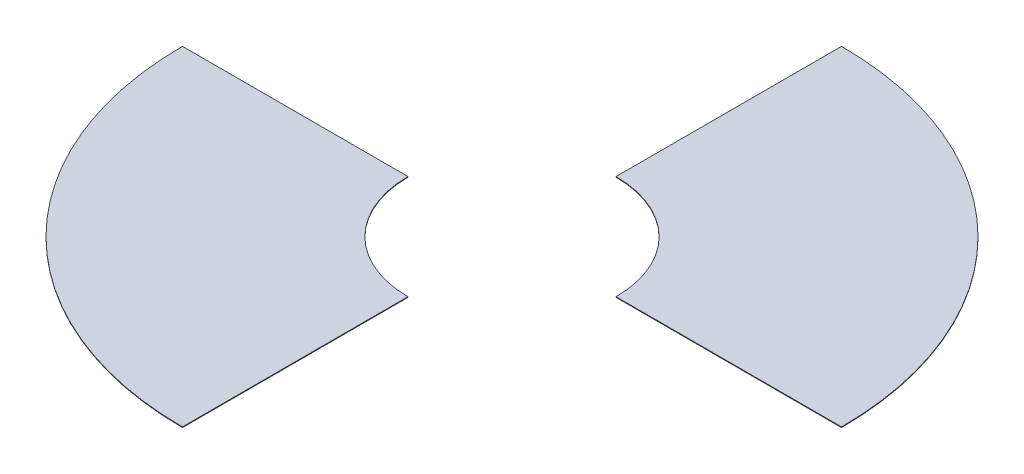
ISO-10303-21;
HEADER;
FILE_DESCRIPTION(('STEP AP214'),'2;1');
FILE_NAME('part.step','',(''),(''),'','','');
FILE_SCHEMA(('AUTOMOTIVE_DESIGN { 1 0 10303 214 1 1 1 1 }'));
ENDSEC;
DATA;
#1=APPLICATION_CONTEXT('core data for automotive mechanical design processes');
#2=APPLICATION_PROTOCOL_DEFINITION('international standard','automotive_design',2000,#1);
#3=PRODUCT_CONTEXT('',#1,'mechanical');
#4=PRODUCT('Part','Part','',(#3));
#5=PRODUCT_RELATED_PRODUCT_CATEGORY('part','',(#4));
#6=PRODUCT_DEFINITION_FORMATION('','',#4);
#7=PRODUCT_DEFINITION_CONTEXT('part definition',#1,'design');
#8=PRODUCT_DEFINITION('design','',#6,#7);
#9=PRODUCT_DEFINITION_SHAPE('','',#8);
#10=(LENGTH_UNIT() NAMED_UNIT(*) SI_UNIT(.MILLI.,.METRE.));
#11=(NAMED_UNIT(*) PLANE_ANGLE_UNIT() SI_UNIT($,.RADIAN.));
#12=(NAMED_UNIT(*) SI_UNIT($,.STERADIAN.) SOLID_ANGLE_UNIT());
#13=UNCERTAINTY_MEASURE_WITH_UNIT(LENGTH_MEASURE(1.E-05),#10,'distance_accuracy_value','');
#14=(GEOMETRIC_REPRESENTATION_CONTEXT(3) GLOBAL_UNCERTAINTY_ASSIGNED_CONTEXT((#13)) GLOBAL_UNIT_ASSIGNED_CONTEXT((#10,
#11,#12)) REPRESENTATION_CONTEXT('',''));
#15=CARTESIAN_POINT('',(0.,0.,0.));
#16=DIRECTION('',(0.,0.,1.));
#17=DIRECTION('',(1.,0.,0.));
#18=AXIS2_PLACEMENT_3D('',#15,#16,#17);
#19=CARTESIAN_POINT('',(0.,0.508,0.));
#20=DIRECTION('',(0.,-1.,0.));
#21=DIRECTION('',(0.,0.,-1.));
#22=AXIS2_PLACEMENT_3D('',#19,#20,#21);
#23=CYLINDRICAL_SURFACE('',#22,76.2);
#24=CARTESIAN_POINT('',(0.,0.,0.));
#25=DIRECTION('',(0.,-1.,0.));
#26=DIRECTION('',(0.,0.,1.));
#27=AXIS2_PLACEMENT_3D('',#24,#25,#26);
#28=CIRCLE('',#27,76.2);
#29=CARTESIAN_POINT('',(0.,0.,76.2));
#30=VERTEX_POINT('',#29);
#31=CARTESIAN_POINT('',(-76.2,0.,0.));
#32=VERTEX_POINT('',#31);
#33=EDGE_CURVE('E106',#30,#32,#28,.T.);
#34=ORIENTED_EDGE('',*,*,#33,.T.);
#35=DIRECTION('',(0.,-1.,0.));
#36=VECTOR('',#35,1.);
#37=CARTESIAN_POINT('',(-76.2,0.508,0.));
#38=LINE('',#37,#36);
#39=CARTESIAN_POINT('',(-76.2,0.508,0.));
#40=VERTEX_POINT('',#39);
#41=EDGE_CURVE('E12',#40,#32,#38,.T.);
#42=ORIENTED_EDGE('',*,*,#41,.F.);
#43=CARTESIAN_POINT('',(0.,0.508,0.));
#44=DIRECTION('',(0.,-1.,0.));
#45=DIRECTION('',(0.,0.,1.));
#46=AXIS2_PLACEMENT_3D('',#43,#44,#45);
#47=CIRCLE('',#46,76.2);
#48=CARTESIAN_POINT('',(0.,0.508,76.2));
#49=VERTEX_POINT('',#48);
#50=EDGE_CURVE('E94',#49,#40,#47,.T.);
#51=ORIENTED_EDGE('',*,*,#50,.F.);
#52=DIRECTION('',(0.,-1.,0.));
#53=VECTOR('',#52,1.);
#54=CARTESIAN_POINT('',(0.,0.508,76.2));
#55=LINE('',#54,#53);
#56=EDGE_CURVE('E102',#49,#30,#55,.T.);
#57=ORIENTED_EDGE('',*,*,#56,.T.);
#58=EDGE_LOOP('',(#34,#42,#51,#57));
#59=FACE_BOUND('',#58,.T.);
#60=ADVANCED_FACE('F43',(#59),#23,.F.);
#61=CARTESIAN_POINT('',(-76.2,0.508,0.));
#62=DIRECTION('',(0.,0.,1.));
#63=DIRECTION('',(1.,0.,0.));
#64=AXIS2_PLACEMENT_3D('',#61,#62,#63);
#65=PLANE('',#64);
#66=DIRECTION('',(-1.,0.,0.));
#67=VECTOR('',#66,1.);
#68=CARTESIAN_POINT('',(-76.2,0.,0.));
#69=LINE('',#68,#67);
#70=CARTESIAN_POINT('',(-241.3,0.,0.));
#71=VERTEX_POINT('',#70);
#72=EDGE_CURVE('E98',#32,#71,#69,.T.);
#73=ORIENTED_EDGE('',*,*,#72,.T.);
#74=DIRECTION('',(0.,-1.,0.));
#75=VECTOR('',#74,1.);
#76=CARTESIAN_POINT('',(-241.3,0.508,0.));
#77=LINE('',#76,#75);
#78=CARTESIAN_POINT('',(-241.3,0.508,0.));
#79=VERTEX_POINT('',#78);
#80=EDGE_CURVE('E51',#79,#71,#77,.T.);
#81=ORIENTED_EDGE('',*,*,#80,.F.);
#82=DIRECTION('',(-1.,0.,0.));
#83=VECTOR('',#82,1.);
#84=CARTESIAN_POINT('',(-76.2,0.508,0.));
#85=LINE('',#84,#83);
#86=EDGE_CURVE('E89',#40,#79,#85,.T.);
#87=ORIENTED_EDGE('',*,*,#86,.F.);
#88=ORIENTED_EDGE('',*,*,#41,.T.);
#89=EDGE_LOOP('',(#73,#81,#87,#88));
#90=FACE_BOUND('',#89,.T.);
#91=ADVANCED_FACE('F97',(#90),#65,.F.);
#92=CARTESIAN_POINT('',(0.,0.508,0.));
#93=DIRECTION('',(0.,-1.,0.));
#94=DIRECTION('',(0.,0.,-1.));
#95=AXIS2_PLACEMENT_3D('',#92,#93,#94);
#96=CYLINDRICAL_SURFACE('',#95,241.3);
#97=CARTESIAN_POINT('',(0.,0.,0.));
#98=DIRECTION('',(0.,1.,0.));
#99=DIRECTION('',(0.,0.,1.));
#100=AXIS2_PLACEMENT_3D('',#97,#98,#99);
#101=CIRCLE('',#100,241.3);
#102=CARTESIAN_POINT('',(0.,0.,241.3));
#103=VERTEX_POINT('',#102);
#104=EDGE_CURVE('E76',#71,#103,#101,.T.);
#105=ORIENTED_EDGE('',*,*,#104,.T.);
#106=DIRECTION('',(0.,-1.,0.));
#107=VECTOR('',#106,1.);
#108=CARTESIAN_POINT('',(0.,0.508,241.3));
#109=LINE('',#108,#107);
#110=CARTESIAN_POINT('',(0.,0.508,241.3));
#111=VERTEX_POINT('',#110);
#112=EDGE_CURVE('E99',#111,#103,#109,.T.);
#113=ORIENTED_EDGE('',*,*,#112,.F.);
#114=CARTESIAN_POINT('',(0.,0.508,0.));
#115=DIRECTION('',(0.,1.,0.));
#116=DIRECTION('',(0.,0.,1.));
#117=AXIS2_PLACEMENT_3D('',#114,#115,#116);
#118=CIRCLE('',#117,241.3);
#119=EDGE_CURVE('E92',#79,#111,#118,.T.);
#120=ORIENTED_EDGE('',*,*,#119,.F.);
#121=ORIENTED_EDGE('',*,*,#80,.T.);
#122=EDGE_LOOP('',(#105,#113,#120,#121));
#123=FACE_BOUND('',#122,.T.);
#124=ADVANCED_FACE('F100',(#123),#96,.T.);
#125=CARTESIAN_POINT('',(0.,0.508,76.2));
#126=DIRECTION('',(-1.,0.,0.));
#127=DIRECTION('',(0.,0.,1.));
#128=AXIS2_PLACEMENT_3D('',#125,#126,#127);
#129=PLANE('',#128);
#130=DIRECTION('',(0.,0.,-1.));
#131=VECTOR('',#130,1.);
#132=CARTESIAN_POINT('',(0.,0.,76.2));
#133=LINE('',#132,#131);
#134=EDGE_CURVE('E82',#103,#30,#133,.T.);
#135=ORIENTED_EDGE('',*,*,#134,.T.);
#136=ORIENTED_EDGE('',*,*,#56,.F.);
#137=DIRECTION('',(0.,0.,-1.));
#138=VECTOR('',#137,1.);
#139=CARTESIAN_POINT('',(0.,0.508,76.2));
#140=LINE('',#139,#138);
#141=EDGE_CURVE('E59',#111,#49,#140,.T.);
#142=ORIENTED_EDGE('',*,*,#141,.F.);
#143=ORIENTED_EDGE('',*,*,#112,.T.);
#144=EDGE_LOOP('',(#135,#136,#142,#143));
#145=FACE_BOUND('',#144,.T.);
#146=ADVANCED_FACE('F113',(#145),#129,.F.);
#147=CARTESIAN_POINT('',(0.,0.508,0.));
#148=DIRECTION('',(0.,1.,0.));
#149=DIRECTION('',(0.,0.,1.));
#150=AXIS2_PLACEMENT_3D('',#147,#148,#149);
#151=PLANE('',#150);
#152=ORIENTED_EDGE('',*,*,#50,.T.);
#153=ORIENTED_EDGE('',*,*,#86,.T.);
#154=ORIENTED_EDGE('',*,*,#119,.T.);
#155=ORIENTED_EDGE('',*,*,#141,.T.);
#156=EDGE_LOOP('',(#152,#153,#154,#155));
#157=FACE_BOUND('',#156,.T.);
#158=ADVANCED_FACE('F90',(#157),#151,.T.);
#159=CARTESIAN_POINT('',(0.,0.,0.));
#160=DIRECTION('',(0.,1.,0.));
#161=DIRECTION('',(0.,0.,1.));
#162=AXIS2_PLACEMENT_3D('',#159,#160,#161);
#163=PLANE('',#162);
#164=ORIENTED_EDGE('',*,*,#33,.F.);
#165=ORIENTED_EDGE('',*,*,#134,.F.);
#166=ORIENTED_EDGE('',*,*,#104,.F.);
#167=ORIENTED_EDGE('',*,*,#72,.F.);
#168=EDGE_LOOP('',(#164,#165,#166,#167));
#169=FACE_BOUND('',#168,.T.);
#170=ADVANCED_FACE('F116',(#169),#163,.F.);
#171=CLOSED_SHELL('',(#60,#91,#124,#146,#158,#170));
#172=MANIFOLD_SOLID_BREP('B2',#171);
#173=CARTESIAN_POINT('',(0.,0.508,0.));
#174=DIRECTION('',(0.,-1.,0.));
#175=DIRECTION('',(0.,0.,-1.));
#176=AXIS2_PLACEMENT_3D('',#173,#174,#175);
#177=CYLINDRICAL_SURFACE('',#176,76.2);
#178=CARTESIAN_POINT('',(0.,0.,0.));
#179=DIRECTION('',(0.,-1.,0.));
#180=DIRECTION('',(0.,0.,1.));
#181=AXIS2_PLACEMENT_3D('',#178,#179,#180);
#182=CIRCLE('',#181,76.2);
#183=CARTESIAN_POINT('',(0.,0.,-76.2));
#184=VERTEX_POINT('',#183);
#185=CARTESIAN_POINT('',(76.2,0.,0.));
#186=VERTEX_POINT('',#185);
#187=EDGE_CURVE('E230',#184,#186,#182,.T.);
#188=ORIENTED_EDGE('',*,*,#187,.T.);
#189=DIRECTION('',(0.,-1.,0.));
#190=VECTOR('',#189,1.);
#191=CARTESIAN_POINT('',(76.2,0.508,0.));
#192=LINE('',#191,#190);
#193=CARTESIAN_POINT('',(76.2,0.508,0.));
#194=VERTEX_POINT('',#193);
#195=EDGE_CURVE('E41',#194,#186,#192,.T.);
#196=ORIENTED_EDGE('',*,*,#195,.F.);
#197=CARTESIAN_POINT('',(0.,0.508,0.));
#198=DIRECTION('',(0.,-1.,0.));
#199=DIRECTION('',(0.,0.,1.));
#200=AXIS2_PLACEMENT_3D('',#197,#198,#199);
#201=CIRCLE('',#200,76.2);
#202=CARTESIAN_POINT('',(0.,0.508,-76.2));
#203=VERTEX_POINT('',#202);
#204=EDGE_CURVE('E218',#203,#194,#201,.T.);
#205=ORIENTED_EDGE('',*,*,#204,.F.);
#206=DIRECTION('',(0.,-1.,0.));
#207=VECTOR('',#206,1.);
#208=CARTESIAN_POINT('',(0.,0.508,-76.2));
#209=LINE('',#208,#207);
#210=EDGE_CURVE('E226',#203,#184,#209,.T.);
#211=ORIENTED_EDGE('',*,*,#210,.T.);
#212=EDGE_LOOP('',(#188,#196,#205,#211));
#213=FACE_BOUND('',#212,.T.);
#214=ADVANCED_FACE('F167',(#213),#177,.F.);
#215=CARTESIAN_POINT('',(76.2,0.508,0.));
#216=DIRECTION('',(0.,0.,-1.));
#217=DIRECTION('',(-1.,0.,0.));
#218=AXIS2_PLACEMENT_3D('',#215,#216,#217);
#219=PLANE('',#218);
#220=DIRECTION('',(1.,0.,0.));
#221=VECTOR('',#220,1.);
#222=CARTESIAN_POINT('',(76.2,0.,0.));
#223=LINE('',#222,#221);
#224=CARTESIAN_POINT('',(241.3,0.,0.));
#225=VERTEX_POINT('',#224);
#226=EDGE_CURVE('E222',#186,#225,#223,.T.);
#227=ORIENTED_EDGE('',*,*,#226,.T.);
#228=DIRECTION('',(0.,-1.,0.));
#229=VECTOR('',#228,1.);
#230=CARTESIAN_POINT('',(241.3,0.508,0.));
#231=LINE('',#230,#229);
#232=CARTESIAN_POINT('',(241.3,0.508,0.));
#233=VERTEX_POINT('',#232);
#234=EDGE_CURVE('E175',#233,#225,#231,.T.);
#235=ORIENTED_EDGE('',*,*,#234,.F.);
#236=DIRECTION('',(1.,0.,0.));
#237=VECTOR('',#236,1.);
#238=CARTESIAN_POINT('',(76.2,0.508,0.));
#239=LINE('',#238,#237);
#240=EDGE_CURVE('E213',#194,#233,#239,.T.);
#241=ORIENTED_EDGE('',*,*,#240,.F.);
#242=ORIENTED_EDGE('',*,*,#195,.T.);
#243=EDGE_LOOP('',(#227,#235,#241,#242));
#244=FACE_BOUND('',#243,.T.);
#245=ADVANCED_FACE('F221',(#244),#219,.F.);
#246=CARTESIAN_POINT('',(0.,0.508,0.));
#247=DIRECTION('',(0.,-1.,0.));
#248=DIRECTION('',(0.,0.,-1.));
#249=AXIS2_PLACEMENT_3D('',#246,#247,#248);
#250=CYLINDRICAL_SURFACE('',#249,241.3);
#251=CARTESIAN_POINT('',(0.,0.,0.));
#252=DIRECTION('',(0.,1.,0.));
#253=DIRECTION('',(0.,0.,1.));
#254=AXIS2_PLACEMENT_3D('',#251,#252,#253);
#255=CIRCLE('',#254,241.3);
#256=CARTESIAN_POINT('',(0.,0.,-241.3));
#257=VERTEX_POINT('',#256);
#258=EDGE_CURVE('E200',#225,#257,#255,.T.);
#259=ORIENTED_EDGE('',*,*,#258,.T.);
#260=DIRECTION('',(0.,-1.,0.));
#261=VECTOR('',#260,1.);
#262=CARTESIAN_POINT('',(0.,0.508,-241.3));
#263=LINE('',#262,#261);
#264=CARTESIAN_POINT('',(0.,0.508,-241.3));
#265=VERTEX_POINT('',#264);
#266=EDGE_CURVE('E223',#265,#257,#263,.T.);
#267=ORIENTED_EDGE('',*,*,#266,.F.);
#268=CARTESIAN_POINT('',(0.,0.508,0.));
#269=DIRECTION('',(0.,1.,0.));
#270=DIRECTION('',(0.,0.,1.));
#271=AXIS2_PLACEMENT_3D('',#268,#269,#270);
#272=CIRCLE('',#271,241.3);
#273=EDGE_CURVE('E216',#233,#265,#272,.T.);
#274=ORIENTED_EDGE('',*,*,#273,.F.);
#275=ORIENTED_EDGE('',*,*,#234,.T.);
#276=EDGE_LOOP('',(#259,#267,#274,#275));
#277=FACE_BOUND('',#276,.T.);
#278=ADVANCED_FACE('F224',(#277),#250,.T.);
#279=CARTESIAN_POINT('',(0.,0.508,-76.2));
#280=DIRECTION('',(1.,0.,0.));
#281=DIRECTION('',(0.,0.,-1.));
#282=AXIS2_PLACEMENT_3D('',#279,#280,#281);
#283=PLANE('',#282);
#284=DIRECTION('',(0.,0.,1.));
#285=VECTOR('',#284,1.);
#286=CARTESIAN_POINT('',(0.,0.,-76.2));
#287=LINE('',#286,#285);
#288=EDGE_CURVE('E206',#257,#184,#287,.T.);
#289=ORIENTED_EDGE('',*,*,#288,.T.);
#290=ORIENTED_EDGE('',*,*,#210,.F.);
#291=DIRECTION('',(0.,0.,1.));
#292=VECTOR('',#291,1.);
#293=CARTESIAN_POINT('',(0.,0.508,-76.2));
#294=LINE('',#293,#292);
#295=EDGE_CURVE('E183',#265,#203,#294,.T.);
#296=ORIENTED_EDGE('',*,*,#295,.F.);
#297=ORIENTED_EDGE('',*,*,#266,.T.);
#298=EDGE_LOOP('',(#289,#290,#296,#297));
#299=FACE_BOUND('',#298,.T.);
#300=ADVANCED_FACE('F237',(#299),#283,.F.);
#301=CARTESIAN_POINT('',(0.,0.508,0.));
#302=DIRECTION('',(0.,1.,0.));
#303=DIRECTION('',(0.,0.,1.));
#304=AXIS2_PLACEMENT_3D('',#301,#302,#303);
#305=PLANE('',#304);
#306=ORIENTED_EDGE('',*,*,#204,.T.);
#307=ORIENTED_EDGE('',*,*,#240,.T.);
#308=ORIENTED_EDGE('',*,*,#273,.T.);
#309=ORIENTED_EDGE('',*,*,#295,.T.);
#310=EDGE_LOOP('',(#306,#307,#308,#309));
#311=FACE_BOUND('',#310,.T.);
#312=ADVANCED_FACE('F214',(#311),#305,.T.);
#313=CARTESIAN_POINT('',(0.,0.,0.));
#314=DIRECTION('',(0.,1.,0.));
#315=DIRECTION('',(0.,0.,1.));
#316=AXIS2_PLACEMENT_3D('',#313,#314,#315);
#317=PLANE('',#316);
#318=ORIENTED_EDGE('',*,*,#187,.F.);
#319=ORIENTED_EDGE('',*,*,#288,.F.);
#320=ORIENTED_EDGE('',*,*,#258,.F.);
#321=ORIENTED_EDGE('',*,*,#226,.F.);
#322=EDGE_LOOP('',(#318,#319,#320,#321));
#323=FACE_BOUND('',#322,.T.);
#324=ADVANCED_FACE('F240',(#323),#317,.F.);
#325=CLOSED_SHELL('',(#214,#245,#278,#300,#312,#324));
#326=MANIFOLD_SOLID_BREP('B6',#325);
#327=ADVANCED_BREP_SHAPE_REPRESENTATION('',(#18,#172,#326),#14);
#328=SHAPE_DEFINITION_REPRESENTATION(#9,#327);
ENDSEC;
END-ISO-10303-21;
